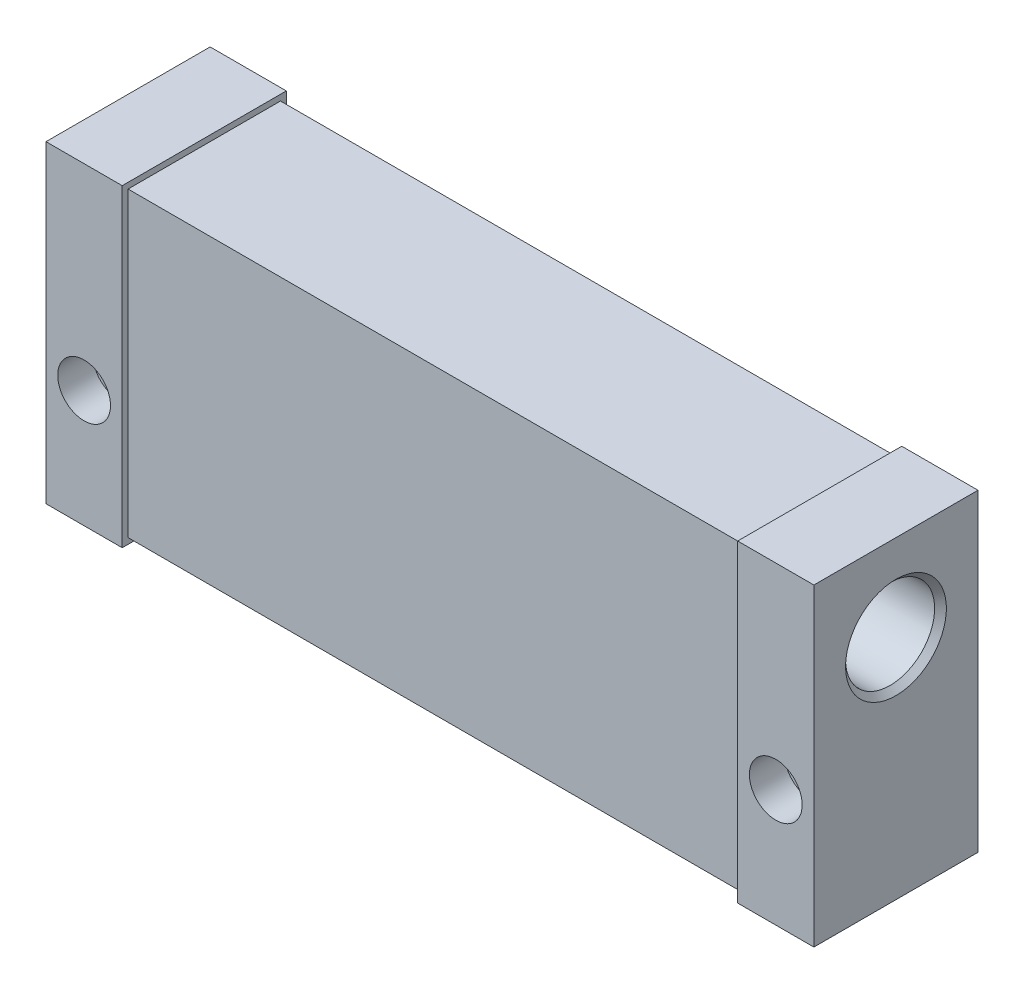
ISO-10303-21;
HEADER;
FILE_DESCRIPTION(('STEP AP214'),'2;1');
FILE_NAME('part.step','',(''),(''),'','','');
FILE_SCHEMA(('AUTOMOTIVE_DESIGN { 1 0 10303 214 1 1 1 1 }'));
ENDSEC;
DATA;
#1=APPLICATION_CONTEXT('core data for automotive mechanical design processes');
#2=APPLICATION_PROTOCOL_DEFINITION('international standard','automotive_design',2000,#1);
#3=PRODUCT_CONTEXT('',#1,'mechanical');
#4=PRODUCT('Part','Part','',(#3));
#5=PRODUCT_RELATED_PRODUCT_CATEGORY('part','',(#4));
#6=PRODUCT_DEFINITION_FORMATION('','',#4);
#7=PRODUCT_DEFINITION_CONTEXT('part definition',#1,'design');
#8=PRODUCT_DEFINITION('design','',#6,#7);
#9=PRODUCT_DEFINITION_SHAPE('','',#8);
#10=(LENGTH_UNIT() NAMED_UNIT(*) SI_UNIT(.MILLI.,.METRE.));
#11=(NAMED_UNIT(*) PLANE_ANGLE_UNIT() SI_UNIT($,.RADIAN.));
#12=(NAMED_UNIT(*) SI_UNIT($,.STERADIAN.) SOLID_ANGLE_UNIT());
#13=UNCERTAINTY_MEASURE_WITH_UNIT(LENGTH_MEASURE(1.E-05),#10,'distance_accuracy_value','');
#14=(GEOMETRIC_REPRESENTATION_CONTEXT(3) GLOBAL_UNCERTAINTY_ASSIGNED_CONTEXT((#13)) GLOBAL_UNIT_ASSIGNED_CONTEXT((#10,
#11,#12)) REPRESENTATION_CONTEXT('',''));
#15=CARTESIAN_POINT('',(0.,0.,0.));
#16=DIRECTION('',(0.,0.,1.));
#17=DIRECTION('',(1.,0.,0.));
#18=AXIS2_PLACEMENT_3D('',#15,#16,#17);
#19=CARTESIAN_POINT('',(-65.5,-26.75,14.));
#20=DIRECTION('',(0.,1.,0.));
#21=DIRECTION('',(0.,0.,1.));
#22=AXIS2_PLACEMENT_3D('',#19,#20,#21);
#23=PLANE('',#22);
#24=CARTESIAN_POINT('',(59.6552513467545,-26.75,-3.));
#25=DIRECTION('',(0.,-1.,0.));
#26=DIRECTION('',(0.,0.,-1.));
#27=AXIS2_PLACEMENT_3D('',#24,#25,#26);
#28=CIRCLE('',#27,2.1);
#29=CARTESIAN_POINT('',(59.6552513467545,-26.75,-5.1));
#30=VERTEX_POINT('',#29);
#31=EDGE_CURVE('E165',#30,#30,#28,.T.);
#32=ORIENTED_EDGE('',*,*,#31,.F.);
#33=EDGE_LOOP('',(#32));
#34=FACE_BOUND('',#33,.T.);
#35=DIRECTION('',(1.,0.,0.));
#36=VECTOR('',#35,1.);
#37=CARTESIAN_POINT('',(-65.5,-26.75,14.));
#38=LINE('',#37,#36);
#39=CARTESIAN_POINT('',(52.5,-26.75,14.));
#40=VERTEX_POINT('',#39);
#41=CARTESIAN_POINT('',(65.5,-26.75,14.));
#42=VERTEX_POINT('',#41);
#43=EDGE_CURVE('E313',#40,#42,#38,.T.);
#44=ORIENTED_EDGE('',*,*,#43,.F.);
#45=DIRECTION('',(0.,0.,-1.));
#46=VECTOR('',#45,1.);
#47=CARTESIAN_POINT('',(52.5,-26.75,14.));
#48=LINE('',#47,#46);
#49=CARTESIAN_POINT('',(52.5,-26.75,-14.));
#50=VERTEX_POINT('',#49);
#51=EDGE_CURVE('E314',#40,#50,#48,.T.);
#52=ORIENTED_EDGE('',*,*,#51,.T.);
#53=DIRECTION('',(1.,0.,0.));
#54=VECTOR('',#53,1.);
#55=CARTESIAN_POINT('',(-65.5,-26.75,-14.));
#56=LINE('',#55,#54);
#57=CARTESIAN_POINT('',(65.5,-26.75,-14.));
#58=VERTEX_POINT('',#57);
#59=EDGE_CURVE('E348',#50,#58,#56,.T.);
#60=ORIENTED_EDGE('',*,*,#59,.T.);
#61=DIRECTION('',(0.,0.,-1.));
#62=VECTOR('',#61,1.);
#63=CARTESIAN_POINT('',(65.5,-26.75,14.));
#64=LINE('',#63,#62);
#65=EDGE_CURVE('E319',#42,#58,#64,.T.);
#66=ORIENTED_EDGE('',*,*,#65,.F.);
#67=EDGE_LOOP('',(#44,#52,#60,#66));
#68=FACE_BOUND('',#67,.T.);
#69=ADVANCED_FACE('F48',(#34,#68),#23,.F.);
#70=CARTESIAN_POINT('',(-65.5,26.75,14.));
#71=DIRECTION('',(0.,-1.,0.));
#72=DIRECTION('',(0.,0.,-1.));
#73=AXIS2_PLACEMENT_3D('',#70,#71,#72);
#74=PLANE('',#73);
#75=DIRECTION('',(-1.,0.,0.));
#76=VECTOR('',#75,1.);
#77=CARTESIAN_POINT('',(-65.5,26.75,-14.));
#78=LINE('',#77,#76);
#79=CARTESIAN_POINT('',(65.5,26.75,-14.));
#80=VERTEX_POINT('',#79);
#81=CARTESIAN_POINT('',(52.5,26.75,-14.));
#82=VERTEX_POINT('',#81);
#83=EDGE_CURVE('E333',#80,#82,#78,.T.);
#84=ORIENTED_EDGE('',*,*,#83,.T.);
#85=DIRECTION('',(0.,0.,1.));
#86=VECTOR('',#85,1.);
#87=CARTESIAN_POINT('',(52.5,26.75,14.));
#88=LINE('',#87,#86);
#89=CARTESIAN_POINT('',(52.5,26.75,14.));
#90=VERTEX_POINT('',#89);
#91=EDGE_CURVE('E72',#82,#90,#88,.T.);
#92=ORIENTED_EDGE('',*,*,#91,.T.);
#93=DIRECTION('',(-1.,0.,0.));
#94=VECTOR('',#93,1.);
#95=CARTESIAN_POINT('',(-65.5,26.75,14.));
#96=LINE('',#95,#94);
#97=CARTESIAN_POINT('',(65.5,26.75,14.));
#98=VERTEX_POINT('',#97);
#99=EDGE_CURVE('E342',#98,#90,#96,.T.);
#100=ORIENTED_EDGE('',*,*,#99,.F.);
#101=DIRECTION('',(0.,0.,-1.));
#102=VECTOR('',#101,1.);
#103=CARTESIAN_POINT('',(65.5,26.75,14.));
#104=LINE('',#103,#102);
#105=EDGE_CURVE('E366',#98,#80,#104,.T.);
#106=ORIENTED_EDGE('',*,*,#105,.T.);
#107=EDGE_LOOP('',(#84,#92,#100,#106));
#108=FACE_BOUND('',#107,.T.);
#109=ADVANCED_FACE('F277',(#108),#74,.F.);
#110=CARTESIAN_POINT('',(-65.5,-26.75,14.));
#111=DIRECTION('',(0.,0.,1.));
#112=DIRECTION('',(1.,0.,0.));
#113=AXIS2_PLACEMENT_3D('',#110,#111,#112);
#114=PLANE('',#113);
#115=CARTESIAN_POINT('',(59.,-6.75,14.));
#116=DIRECTION('',(0.,0.,1.));
#117=DIRECTION('',(1.,0.,0.));
#118=AXIS2_PLACEMENT_3D('',#115,#116,#117);
#119=CIRCLE('',#118,4.5);
#120=CARTESIAN_POINT('',(63.5,-6.75,14.));
#121=VERTEX_POINT('',#120);
#122=EDGE_CURVE('E193',#121,#121,#119,.T.);
#123=ORIENTED_EDGE('',*,*,#122,.F.);
#124=EDGE_LOOP('',(#123));
#125=FACE_BOUND('',#124,.T.);
#126=DIRECTION('',(0.,1.,0.));
#127=VECTOR('',#126,1.);
#128=CARTESIAN_POINT('',(52.5,-26.75,14.));
#129=LINE('',#128,#127);
#130=EDGE_CURVE('E351',#40,#90,#129,.T.);
#131=ORIENTED_EDGE('',*,*,#130,.F.);
#132=ORIENTED_EDGE('',*,*,#43,.T.);
#133=DIRECTION('',(0.,1.,0.));
#134=VECTOR('',#133,1.);
#135=CARTESIAN_POINT('',(65.5,26.75,14.));
#136=LINE('',#135,#134);
#137=EDGE_CURVE('E331',#42,#98,#136,.T.);
#138=ORIENTED_EDGE('',*,*,#137,.T.);
#139=ORIENTED_EDGE('',*,*,#99,.T.);
#140=EDGE_LOOP('',(#131,#132,#138,#139));
#141=FACE_BOUND('',#140,.T.);
#142=ADVANCED_FACE('F266',(#125,#141),#114,.T.);
#143=CARTESIAN_POINT('',(-65.5,-26.75,-14.));
#144=DIRECTION('',(0.,0.,1.));
#145=DIRECTION('',(1.,0.,0.));
#146=AXIS2_PLACEMENT_3D('',#143,#144,#145);
#147=PLANE('',#146);
#148=CARTESIAN_POINT('',(59.,-6.75,-14.));
#149=DIRECTION('',(0.,0.,1.));
#150=DIRECTION('',(1.,0.,0.));
#151=AXIS2_PLACEMENT_3D('',#148,#149,#150);
#152=CIRCLE('',#151,2.74999999999999);
#153=CARTESIAN_POINT('',(61.75,-6.75,-14.));
#154=VERTEX_POINT('',#153);
#155=EDGE_CURVE('E182',#154,#154,#152,.T.);
#156=ORIENTED_EDGE('',*,*,#155,.T.);
#157=EDGE_LOOP('',(#156));
#158=FACE_BOUND('',#157,.T.);
#159=ORIENTED_EDGE('',*,*,#59,.F.);
#160=DIRECTION('',(0.,1.,0.));
#161=VECTOR('',#160,1.);
#162=CARTESIAN_POINT('',(52.5,-26.75,-14.));
#163=LINE('',#162,#161);
#164=EDGE_CURVE('E378',#50,#82,#163,.T.);
#165=ORIENTED_EDGE('',*,*,#164,.T.);
#166=ORIENTED_EDGE('',*,*,#83,.F.);
#167=DIRECTION('',(0.,1.,0.));
#168=VECTOR('',#167,1.);
#169=CARTESIAN_POINT('',(65.5,26.75,-14.));
#170=LINE('',#169,#168);
#171=EDGE_CURVE('E358',#58,#80,#170,.T.);
#172=ORIENTED_EDGE('',*,*,#171,.F.);
#173=EDGE_LOOP('',(#159,#165,#166,#172));
#174=FACE_BOUND('',#173,.T.);
#175=ADVANCED_FACE('F272',(#158,#174),#147,.F.);
#176=CARTESIAN_POINT('',(65.5,26.75,14.));
#177=DIRECTION('',(-1.,0.,0.));
#178=DIRECTION('',(0.,0.,1.));
#179=AXIS2_PLACEMENT_3D('',#176,#177,#178);
#180=PLANE('',#179);
#181=CARTESIAN_POINT('',(65.5,12.,0.));
#182=DIRECTION('',(-1.,0.,0.));
#183=DIRECTION('',(0.,0.,1.));
#184=AXIS2_PLACEMENT_3D('',#181,#182,#183);
#185=CIRCLE('',#184,8.59999999999998);
#186=CARTESIAN_POINT('',(65.5,12.,8.59999999999998));
#187=VERTEX_POINT('',#186);
#188=EDGE_CURVE('E12',#187,#187,#185,.T.);
#189=ORIENTED_EDGE('',*,*,#188,.T.);
#190=EDGE_LOOP('',(#189));
#191=FACE_BOUND('',#190,.T.);
#192=ORIENTED_EDGE('',*,*,#171,.T.);
#193=ORIENTED_EDGE('',*,*,#105,.F.);
#194=ORIENTED_EDGE('',*,*,#137,.F.);
#195=ORIENTED_EDGE('',*,*,#65,.T.);
#196=EDGE_LOOP('',(#192,#193,#194,#195));
#197=FACE_BOUND('',#196,.T.);
#198=ADVANCED_FACE('F259',(#191,#197),#180,.F.);
#199=CARTESIAN_POINT('',(-52.5,-25.75,13.));
#200=DIRECTION('',(0.,0.,1.));
#201=DIRECTION('',(1.,0.,0.));
#202=AXIS2_PLACEMENT_3D('',#199,#200,#201);
#203=PLANE('',#202);
#204=CARTESIAN_POINT('',(52.5,25.75,13.));
#205=DIRECTION('',(-1.,0.,0.));
#206=VECTOR('',#205,1.);
#207=LINE('',#204,#206);
#208=CARTESIAN_POINT('',(52.5,25.75,13.));
#209=VERTEX_POINT('',#208);
#210=CARTESIAN_POINT('',(-52.5,25.75,13.));
#211=VERTEX_POINT('',#210);
#212=EDGE_CURVE('E234',#209,#211,#207,.T.);
#213=ORIENTED_EDGE('',*,*,#212,.T.);
#214=DIRECTION('',(0.,1.,0.));
#215=VECTOR('',#214,1.);
#216=CARTESIAN_POINT('',(-52.5,-25.75,13.));
#217=LINE('',#216,#215);
#218=CARTESIAN_POINT('',(-52.5,-25.75,13.));
#219=VERTEX_POINT('',#218);
#220=EDGE_CURVE('E203',#219,#211,#217,.T.);
#221=ORIENTED_EDGE('',*,*,#220,.F.);
#222=DIRECTION('',(1.,0.,0.));
#223=VECTOR('',#222,1.);
#224=CARTESIAN_POINT('',(-52.5,-25.75,13.));
#225=LINE('',#224,#223);
#226=CARTESIAN_POINT('',(52.5,-25.7499999999999,13.));
#227=VERTEX_POINT('',#226);
#228=EDGE_CURVE('E198',#219,#227,#225,.T.);
#229=ORIENTED_EDGE('',*,*,#228,.T.);
#230=DIRECTION('',(0.,1.,0.));
#231=VECTOR('',#230,1.);
#232=CARTESIAN_POINT('',(52.5,-25.7499999999999,13.));
#233=LINE('',#232,#231);
#234=EDGE_CURVE('E229',#227,#209,#233,.T.);
#235=ORIENTED_EDGE('',*,*,#234,.T.);
#236=EDGE_LOOP('',(#213,#221,#229,#235));
#237=FACE_BOUND('',#236,.T.);
#238=ADVANCED_FACE('F250',(#237),#203,.T.);
#239=CARTESIAN_POINT('',(-52.5,-25.75,-13.));
#240=DIRECTION('',(0.,1.,0.));
#241=DIRECTION('',(-1.,0.,0.));
#242=AXIS2_PLACEMENT_3D('',#239,#240,#241);
#243=PLANE('',#242);
#244=DIRECTION('',(0.,0.,1.));
#245=VECTOR('',#244,1.);
#246=CARTESIAN_POINT('',(-52.5,-25.75,-13.));
#247=LINE('',#246,#245);
#248=CARTESIAN_POINT('',(-52.5,-25.75,-13.));
#249=VERTEX_POINT('',#248);
#250=EDGE_CURVE('E208',#249,#219,#247,.T.);
#251=ORIENTED_EDGE('',*,*,#250,.F.);
#252=DIRECTION('',(-1.,0.,0.));
#253=VECTOR('',#252,1.);
#254=CARTESIAN_POINT('',(-52.5,-25.75,-13.));
#255=LINE('',#254,#253);
#256=CARTESIAN_POINT('',(52.5,-25.75,-13.));
#257=VERTEX_POINT('',#256);
#258=EDGE_CURVE('E207',#257,#249,#255,.T.);
#259=ORIENTED_EDGE('',*,*,#258,.F.);
#260=DIRECTION('',(0.,0.,1.));
#261=VECTOR('',#260,1.);
#262=CARTESIAN_POINT('',(52.5,-25.75,-13.));
#263=LINE('',#262,#261);
#264=EDGE_CURVE('E205',#257,#227,#263,.T.);
#265=ORIENTED_EDGE('',*,*,#264,.T.);
#266=ORIENTED_EDGE('',*,*,#228,.F.);
#267=EDGE_LOOP('',(#251,#259,#265,#266));
#268=FACE_BOUND('',#267,.T.);
#269=ADVANCED_FACE('F260',(#268),#243,.F.);
#270=CARTESIAN_POINT('',(-52.5000000000001,25.75,-13.));
#271=DIRECTION('',(0.,0.,-1.));
#272=DIRECTION('',(-1.,0.,0.));
#273=AXIS2_PLACEMENT_3D('',#270,#271,#272);
#274=PLANE('',#273);
#275=ORIENTED_EDGE('',*,*,#258,.T.);
#276=DIRECTION('',(0.,-1.,0.));
#277=VECTOR('',#276,1.);
#278=CARTESIAN_POINT('',(-52.5,25.75,-13.));
#279=LINE('',#278,#277);
#280=CARTESIAN_POINT('',(-52.5,25.75,-13.));
#281=VERTEX_POINT('',#280);
#282=EDGE_CURVE('E217',#281,#249,#279,.T.);
#283=ORIENTED_EDGE('',*,*,#282,.F.);
#284=DIRECTION('',(1.,0.,0.));
#285=VECTOR('',#284,1.);
#286=CARTESIAN_POINT('',(-52.5000000000001,25.75,-13.));
#287=LINE('',#286,#285);
#288=CARTESIAN_POINT('',(52.5,25.75,-13.));
#289=VERTEX_POINT('',#288);
#290=EDGE_CURVE('E215',#281,#289,#287,.T.);
#291=ORIENTED_EDGE('',*,*,#290,.T.);
#292=DIRECTION('',(0.,-1.,0.));
#293=VECTOR('',#292,1.);
#294=CARTESIAN_POINT('',(52.5,25.75,-13.));
#295=LINE('',#294,#293);
#296=EDGE_CURVE('E212',#289,#257,#295,.T.);
#297=ORIENTED_EDGE('',*,*,#296,.T.);
#298=EDGE_LOOP('',(#275,#283,#291,#297));
#299=FACE_BOUND('',#298,.T.);
#300=ADVANCED_FACE('F448',(#299),#274,.T.);
#301=CARTESIAN_POINT('',(-52.5,25.75,-225.388235098391));
#302=DIRECTION('',(0.,-1.,0.));
#303=DIRECTION('',(0.,0.,-1.));
#304=AXIS2_PLACEMENT_3D('',#301,#302,#303);
#305=PLANE('',#304);
#306=DIRECTION('',(0.,0.,1.));
#307=VECTOR('',#306,1.);
#308=CARTESIAN_POINT('',(-52.5,25.75,-225.388235098391));
#309=LINE('',#308,#307);
#310=EDGE_CURVE('E196',#281,#211,#309,.T.);
#311=ORIENTED_EDGE('',*,*,#310,.T.);
#312=ORIENTED_EDGE('',*,*,#212,.F.);
#313=DIRECTION('',(0.,0.,1.));
#314=VECTOR('',#313,1.);
#315=CARTESIAN_POINT('',(52.5,25.75,-225.388235098391));
#316=LINE('',#315,#314);
#317=EDGE_CURVE('E219',#289,#209,#316,.T.);
#318=ORIENTED_EDGE('',*,*,#317,.F.);
#319=ORIENTED_EDGE('',*,*,#290,.F.);
#320=EDGE_LOOP('',(#311,#312,#318,#319));
#321=FACE_BOUND('',#320,.T.);
#322=ADVANCED_FACE('F437',(#321),#305,.F.);
#323=CARTESIAN_POINT('',(52.5,29.0354580165229,-225.388235098391));
#324=DIRECTION('',(1.,0.,0.));
#325=DIRECTION('',(0.,0.,-1.));
#326=AXIS2_PLACEMENT_3D('',#323,#324,#325);
#327=PLANE('',#326);
#328=ORIENTED_EDGE('',*,*,#130,.T.);
#329=ORIENTED_EDGE('',*,*,#91,.F.);
#330=ORIENTED_EDGE('',*,*,#164,.F.);
#331=ORIENTED_EDGE('',*,*,#51,.F.);
#332=EDGE_LOOP('',(#328,#329,#330,#331));
#333=FACE_BOUND('',#332,.T.);
#334=ORIENTED_EDGE('',*,*,#317,.T.);
#335=ORIENTED_EDGE('',*,*,#234,.F.);
#336=ORIENTED_EDGE('',*,*,#264,.F.);
#337=ORIENTED_EDGE('',*,*,#296,.F.);
#338=EDGE_LOOP('',(#334,#335,#336,#337));
#339=FACE_BOUND('',#338,.T.);
#340=ADVANCED_FACE('F446',(#333,#339),#327,.F.);
#341=CARTESIAN_POINT('',(-52.5,25.75,-225.388235098391));
#342=DIRECTION('',(-1.,0.,0.));
#343=DIRECTION('',(0.,0.,1.));
#344=AXIS2_PLACEMENT_3D('',#341,#342,#343);
#345=PLANE('',#344);
#346=DIRECTION('',(0.,-1.,0.));
#347=VECTOR('',#346,1.);
#348=CARTESIAN_POINT('',(-52.5,-26.75,14.));
#349=LINE('',#348,#347);
#350=CARTESIAN_POINT('',(-52.5,26.75,14.));
#351=VERTEX_POINT('',#350);
#352=CARTESIAN_POINT('',(-52.5,-26.75,14.));
#353=VERTEX_POINT('',#352);
#354=EDGE_CURVE('E401',#351,#353,#349,.T.);
#355=ORIENTED_EDGE('',*,*,#354,.T.);
#356=DIRECTION('',(0.,0.,1.));
#357=VECTOR('',#356,1.);
#358=CARTESIAN_POINT('',(-52.5,-26.75,14.));
#359=LINE('',#358,#357);
#360=CARTESIAN_POINT('',(-52.5,-26.75,-14.));
#361=VERTEX_POINT('',#360);
#362=EDGE_CURVE('E61',#361,#353,#359,.T.);
#363=ORIENTED_EDGE('',*,*,#362,.F.);
#364=DIRECTION('',(0.,-1.,0.));
#365=VECTOR('',#364,1.);
#366=CARTESIAN_POINT('',(-52.5,-26.75,-14.));
#367=LINE('',#366,#365);
#368=CARTESIAN_POINT('',(-52.5,26.75,-14.));
#369=VERTEX_POINT('',#368);
#370=EDGE_CURVE('E376',#369,#361,#367,.T.);
#371=ORIENTED_EDGE('',*,*,#370,.F.);
#372=DIRECTION('',(0.,0.,-1.));
#373=VECTOR('',#372,1.);
#374=CARTESIAN_POINT('',(-52.5,26.75,14.));
#375=LINE('',#374,#373);
#376=EDGE_CURVE('E403',#351,#369,#375,.T.);
#377=ORIENTED_EDGE('',*,*,#376,.F.);
#378=EDGE_LOOP('',(#355,#363,#371,#377));
#379=FACE_BOUND('',#378,.T.);
#380=ORIENTED_EDGE('',*,*,#282,.T.);
#381=ORIENTED_EDGE('',*,*,#250,.T.);
#382=ORIENTED_EDGE('',*,*,#220,.T.);
#383=ORIENTED_EDGE('',*,*,#310,.F.);
#384=EDGE_LOOP('',(#380,#381,#382,#383));
#385=FACE_BOUND('',#384,.T.);
#386=ADVANCED_FACE('F283',(#379,#385),#345,.F.);
#387=CARTESIAN_POINT('',(-65.5,26.75,14.));
#388=DIRECTION('',(1.,0.,0.));
#389=DIRECTION('',(0.,1.,0.));
#390=AXIS2_PLACEMENT_3D('',#387,#388,#389);
#391=PLANE('',#390);
#392=CARTESIAN_POINT('',(-65.5,12.,0.));
#393=DIRECTION('',(1.,0.,0.));
#394=DIRECTION('',(0.,1.,0.));
#395=AXIS2_PLACEMENT_3D('',#392,#393,#394);
#396=CIRCLE('',#395,8.60000000000004);
#397=CARTESIAN_POINT('',(-65.5,20.6,0.));
#398=VERTEX_POINT('',#397);
#399=EDGE_CURVE('E60',#398,#398,#396,.T.);
#400=ORIENTED_EDGE('',*,*,#399,.T.);
#401=EDGE_LOOP('',(#400));
#402=FACE_BOUND('',#401,.T.);
#403=DIRECTION('',(0.,-1.,0.));
#404=VECTOR('',#403,1.);
#405=CARTESIAN_POINT('',(-65.5,26.75,-14.));
#406=LINE('',#405,#404);
#407=CARTESIAN_POINT('',(-65.5,26.75,-14.));
#408=VERTEX_POINT('',#407);
#409=CARTESIAN_POINT('',(-65.5,-26.75,-14.));
#410=VERTEX_POINT('',#409);
#411=EDGE_CURVE('E347',#408,#410,#406,.T.);
#412=ORIENTED_EDGE('',*,*,#411,.T.);
#413=DIRECTION('',(0.,0.,-1.));
#414=VECTOR('',#413,1.);
#415=CARTESIAN_POINT('',(-65.5,-26.75,14.));
#416=LINE('',#415,#414);
#417=CARTESIAN_POINT('',(-65.5,-26.75,14.));
#418=VERTEX_POINT('',#417);
#419=EDGE_CURVE('E375',#418,#410,#416,.T.);
#420=ORIENTED_EDGE('',*,*,#419,.F.);
#421=DIRECTION('',(0.,-1.,0.));
#422=VECTOR('',#421,1.);
#423=CARTESIAN_POINT('',(-65.5,26.75,14.));
#424=LINE('',#423,#422);
#425=CARTESIAN_POINT('',(-65.5,26.75,14.));
#426=VERTEX_POINT('',#425);
#427=EDGE_CURVE('E321',#426,#418,#424,.T.);
#428=ORIENTED_EDGE('',*,*,#427,.F.);
#429=DIRECTION('',(0.,0.,-1.));
#430=VECTOR('',#429,1.);
#431=CARTESIAN_POINT('',(-65.5,26.75,14.));
#432=LINE('',#431,#430);
#433=EDGE_CURVE('E343',#426,#408,#432,.T.);
#434=ORIENTED_EDGE('',*,*,#433,.T.);
#435=EDGE_LOOP('',(#412,#420,#428,#434));
#436=FACE_BOUND('',#435,.T.);
#437=ADVANCED_FACE('F268',(#402,#436),#391,.F.);
#438=CARTESIAN_POINT('',(-59.,-6.75,-14.));
#439=DIRECTION('',(0.,0.,1.));
#440=DIRECTION('',(1.,0.,0.));
#441=AXIS2_PLACEMENT_3D('',#438,#439,#440);
#442=CIRCLE('',#441,2.74999999999999);
#443=CARTESIAN_POINT('',(-56.25,-6.75,-14.));
#444=VERTEX_POINT('',#443);
#445=EDGE_CURVE('E170',#444,#444,#442,.T.);
#446=ORIENTED_EDGE('',*,*,#445,.T.);
#447=EDGE_LOOP('',(#446));
#448=FACE_BOUND('',#447,.T.);
#449=EDGE_CURVE('E360',#369,#408,#78,.T.);
#450=ORIENTED_EDGE('',*,*,#449,.F.);
#451=ORIENTED_EDGE('',*,*,#370,.T.);
#452=EDGE_CURVE('E352',#410,#361,#56,.T.);
#453=ORIENTED_EDGE('',*,*,#452,.F.);
#454=ORIENTED_EDGE('',*,*,#411,.F.);
#455=EDGE_LOOP('',(#450,#451,#453,#454));
#456=FACE_BOUND('',#455,.T.);
#457=ADVANCED_FACE('F261',(#448,#456),#147,.F.);
#458=CARTESIAN_POINT('',(-59.,-6.75,14.));
#459=DIRECTION('',(0.,0.,1.));
#460=DIRECTION('',(1.,0.,0.));
#461=AXIS2_PLACEMENT_3D('',#458,#459,#460);
#462=CIRCLE('',#461,4.5);
#463=CARTESIAN_POINT('',(-54.5,-6.75,14.));
#464=VERTEX_POINT('',#463);
#465=EDGE_CURVE('E177',#464,#464,#462,.T.);
#466=ORIENTED_EDGE('',*,*,#465,.F.);
#467=EDGE_LOOP('',(#466));
#468=FACE_BOUND('',#467,.T.);
#469=ORIENTED_EDGE('',*,*,#354,.F.);
#470=EDGE_CURVE('E338',#351,#426,#96,.T.);
#471=ORIENTED_EDGE('',*,*,#470,.T.);
#472=ORIENTED_EDGE('',*,*,#427,.T.);
#473=EDGE_CURVE('E324',#418,#353,#38,.T.);
#474=ORIENTED_EDGE('',*,*,#473,.T.);
#475=EDGE_LOOP('',(#469,#471,#472,#474));
#476=FACE_BOUND('',#475,.T.);
#477=ADVANCED_FACE('F258',(#468,#476),#114,.T.);
#478=ORIENTED_EDGE('',*,*,#470,.F.);
#479=ORIENTED_EDGE('',*,*,#376,.T.);
#480=ORIENTED_EDGE('',*,*,#449,.T.);
#481=ORIENTED_EDGE('',*,*,#433,.F.);
#482=EDGE_LOOP('',(#478,#479,#480,#481));
#483=FACE_BOUND('',#482,.T.);
#484=ADVANCED_FACE('F265',(#483),#74,.F.);
#485=CARTESIAN_POINT('',(-59.,-26.75,-3.));
#486=DIRECTION('',(0.,-1.,0.));
#487=DIRECTION('',(0.,0.,-1.));
#488=AXIS2_PLACEMENT_3D('',#485,#486,#487);
#489=CIRCLE('',#488,2.1);
#490=CARTESIAN_POINT('',(-59.,-26.75,-5.1));
#491=VERTEX_POINT('',#490);
#492=EDGE_CURVE('E154',#491,#491,#489,.T.);
#493=ORIENTED_EDGE('',*,*,#492,.F.);
#494=EDGE_LOOP('',(#493));
#495=FACE_BOUND('',#494,.T.);
#496=ORIENTED_EDGE('',*,*,#452,.T.);
#497=ORIENTED_EDGE('',*,*,#362,.T.);
#498=ORIENTED_EDGE('',*,*,#473,.F.);
#499=ORIENTED_EDGE('',*,*,#419,.T.);
#500=EDGE_LOOP('',(#496,#497,#498,#499));
#501=FACE_BOUND('',#500,.T.);
#502=ADVANCED_FACE('F274',(#495,#501),#23,.F.);
#503=CARTESIAN_POINT('',(65.5,12.,0.));
#504=DIRECTION('',(-1.,0.,0.));
#505=DIRECTION('',(0.,-1.,0.));
#506=AXIS2_PLACEMENT_3D('',#503,#504,#505);
#507=CYLINDRICAL_SURFACE('',#506,7.6);
#508=CARTESIAN_POINT('',(-64.5,12.,0.));
#509=DIRECTION('',(1.,0.,0.));
#510=DIRECTION('',(0.,1.,0.));
#511=AXIS2_PLACEMENT_3D('',#508,#509,#510);
#512=CIRCLE('',#511,7.6);
#513=CARTESIAN_POINT('',(-64.5,19.6,0.));
#514=VERTEX_POINT('',#513);
#515=EDGE_CURVE('E387',#514,#514,#512,.F.);
#516=ORIENTED_EDGE('',*,*,#515,.T.);
#517=EDGE_LOOP('',(#516));
#518=FACE_BOUND('',#517,.T.);
#519=CARTESIAN_POINT('',(64.5,12.,0.));
#520=DIRECTION('',(-1.,0.,0.));
#521=DIRECTION('',(0.,0.,1.));
#522=AXIS2_PLACEMENT_3D('',#519,#520,#521);
#523=CIRCLE('',#522,7.6);
#524=CARTESIAN_POINT('',(64.5,12.,7.6));
#525=VERTEX_POINT('',#524);
#526=EDGE_CURVE('E385',#525,#525,#523,.F.);
#527=ORIENTED_EDGE('',*,*,#526,.T.);
#528=EDGE_LOOP('',(#527));
#529=FACE_BOUND('',#528,.T.);
#530=ADVANCED_FACE('F284',(#518,#529),#507,.F.);
#531=CARTESIAN_POINT('',(59.,-6.75,14.));
#532=DIRECTION('',(0.,0.,1.));
#533=DIRECTION('',(1.,0.,0.));
#534=AXIS2_PLACEMENT_3D('',#531,#532,#533);
#535=CYLINDRICAL_SURFACE('',#534,4.5);
#536=CARTESIAN_POINT('',(59.,-6.75,8.));
#537=DIRECTION('',(0.,0.,1.));
#538=DIRECTION('',(1.,0.,0.));
#539=AXIS2_PLACEMENT_3D('',#536,#537,#538);
#540=CIRCLE('',#539,4.5);
#541=CARTESIAN_POINT('',(63.5,-6.75,8.));
#542=VERTEX_POINT('',#541);
#543=EDGE_CURVE('E192',#542,#542,#540,.T.);
#544=ORIENTED_EDGE('',*,*,#543,.F.);
#545=EDGE_LOOP('',(#544));
#546=FACE_BOUND('',#545,.T.);
#547=ORIENTED_EDGE('',*,*,#122,.T.);
#548=EDGE_LOOP('',(#547));
#549=FACE_BOUND('',#548,.T.);
#550=ADVANCED_FACE('F530',(#546,#549),#535,.F.);
#551=CARTESIAN_POINT('',(61.75,-6.75,8.));
#552=DIRECTION('',(0.,0.,-1.));
#553=DIRECTION('',(-1.,0.,0.));
#554=AXIS2_PLACEMENT_3D('',#551,#552,#553);
#555=PLANE('',#554);
#556=CARTESIAN_POINT('',(59.,-6.75,8.));
#557=DIRECTION('',(0.,0.,1.));
#558=DIRECTION('',(1.,0.,0.));
#559=AXIS2_PLACEMENT_3D('',#556,#557,#558);
#560=CIRCLE('',#559,2.75);
#561=CARTESIAN_POINT('',(61.75,-6.75,8.));
#562=VERTEX_POINT('',#561);
#563=EDGE_CURVE('E190',#562,#562,#560,.T.);
#564=ORIENTED_EDGE('',*,*,#563,.F.);
#565=EDGE_LOOP('',(#564));
#566=FACE_BOUND('',#565,.T.);
#567=ORIENTED_EDGE('',*,*,#543,.T.);
#568=EDGE_LOOP('',(#567));
#569=FACE_BOUND('',#568,.T.);
#570=ADVANCED_FACE('F534',(#566,#569),#555,.F.);
#571=CARTESIAN_POINT('',(59.,-6.75,14.));
#572=DIRECTION('',(0.,0.,1.));
#573=DIRECTION('',(1.,0.,0.));
#574=AXIS2_PLACEMENT_3D('',#571,#572,#573);
#575=CYLINDRICAL_SURFACE('',#574,2.75);
#576=ORIENTED_EDGE('',*,*,#155,.F.);
#577=EDGE_LOOP('',(#576));
#578=FACE_BOUND('',#577,.T.);
#579=ORIENTED_EDGE('',*,*,#563,.T.);
#580=EDGE_LOOP('',(#579));
#581=FACE_BOUND('',#580,.T.);
#582=ADVANCED_FACE('F545',(#578,#581),#575,.F.);
#583=CARTESIAN_POINT('',(-59.,-6.75,14.));
#584=DIRECTION('',(0.,0.,1.));
#585=DIRECTION('',(1.,0.,0.));
#586=AXIS2_PLACEMENT_3D('',#583,#584,#585);
#587=CYLINDRICAL_SURFACE('',#586,4.5);
#588=CARTESIAN_POINT('',(-59.,-6.75,8.));
#589=DIRECTION('',(0.,0.,1.));
#590=DIRECTION('',(1.,0.,0.));
#591=AXIS2_PLACEMENT_3D('',#588,#589,#590);
#592=CIRCLE('',#591,4.5);
#593=CARTESIAN_POINT('',(-54.5,-6.75,8.));
#594=VERTEX_POINT('',#593);
#595=EDGE_CURVE('E174',#594,#594,#592,.T.);
#596=ORIENTED_EDGE('',*,*,#595,.F.);
#597=EDGE_LOOP('',(#596));
#598=FACE_BOUND('',#597,.T.);
#599=ORIENTED_EDGE('',*,*,#465,.T.);
#600=EDGE_LOOP('',(#599));
#601=FACE_BOUND('',#600,.T.);
#602=ADVANCED_FACE('F552',(#598,#601),#587,.F.);
#603=CARTESIAN_POINT('',(-56.25,-6.75,8.));
#604=DIRECTION('',(0.,0.,-1.));
#605=DIRECTION('',(-1.,0.,0.));
#606=AXIS2_PLACEMENT_3D('',#603,#604,#605);
#607=PLANE('',#606);
#608=CARTESIAN_POINT('',(-59.,-6.75,8.));
#609=DIRECTION('',(0.,0.,1.));
#610=DIRECTION('',(1.,0.,0.));
#611=AXIS2_PLACEMENT_3D('',#608,#609,#610);
#612=CIRCLE('',#611,2.75);
#613=CARTESIAN_POINT('',(-56.25,-6.75,8.));
#614=VERTEX_POINT('',#613);
#615=EDGE_CURVE('E171',#614,#614,#612,.T.);
#616=ORIENTED_EDGE('',*,*,#615,.F.);
#617=EDGE_LOOP('',(#616));
#618=FACE_BOUND('',#617,.T.);
#619=ORIENTED_EDGE('',*,*,#595,.T.);
#620=EDGE_LOOP('',(#619));
#621=FACE_BOUND('',#620,.T.);
#622=ADVANCED_FACE('F296',(#618,#621),#607,.F.);
#623=CARTESIAN_POINT('',(-59.,-6.75,14.));
#624=DIRECTION('',(0.,0.,1.));
#625=DIRECTION('',(1.,0.,0.));
#626=AXIS2_PLACEMENT_3D('',#623,#624,#625);
#627=CYLINDRICAL_SURFACE('',#626,2.75);
#628=ORIENTED_EDGE('',*,*,#445,.F.);
#629=EDGE_LOOP('',(#628));
#630=FACE_BOUND('',#629,.T.);
#631=ORIENTED_EDGE('',*,*,#615,.T.);
#632=EDGE_LOOP('',(#631));
#633=FACE_BOUND('',#632,.T.);
#634=ADVANCED_FACE('F288',(#630,#633),#627,.F.);
#635=CARTESIAN_POINT('',(-64.5,12.,0.));
#636=DIRECTION('',(-1.,0.,0.));
#637=DIRECTION('',(0.,-1.,0.));
#638=AXIS2_PLACEMENT_3D('',#635,#636,#637);
#639=CONICAL_SURFACE('',#638,7.6,0.785398163397454);
#640=ORIENTED_EDGE('',*,*,#399,.F.);
#641=EDGE_LOOP('',(#640));
#642=FACE_BOUND('',#641,.T.);
#643=ORIENTED_EDGE('',*,*,#515,.F.);
#644=EDGE_LOOP('',(#643));
#645=FACE_BOUND('',#644,.T.);
#646=ADVANCED_FACE('F287',(#642,#645),#639,.F.);
#647=CARTESIAN_POINT('',(65.5,12.,0.));
#648=DIRECTION('',(1.,0.,0.));
#649=DIRECTION('',(0.,0.,-1.));
#650=AXIS2_PLACEMENT_3D('',#647,#648,#649);
#651=CONICAL_SURFACE('',#650,8.59999999999998,0.785398163397438);
#652=ORIENTED_EDGE('',*,*,#526,.F.);
#653=EDGE_LOOP('',(#652));
#654=FACE_BOUND('',#653,.T.);
#655=ORIENTED_EDGE('',*,*,#188,.F.);
#656=EDGE_LOOP('',(#655));
#657=FACE_BOUND('',#656,.T.);
#658=ADVANCED_FACE('F49',(#654,#657),#651,.F.);
#659=CARTESIAN_POINT('',(59.6552513467545,-26.75,-3.));
#660=DIRECTION('',(0.,-1.,0.));
#661=DIRECTION('',(0.,0.,-1.));
#662=AXIS2_PLACEMENT_3D('',#659,#660,#661);
#663=CYLINDRICAL_SURFACE('',#662,2.1);
#664=CARTESIAN_POINT('',(59.6552513467545,-14.35,-3.));
#665=DIRECTION('',(0.,-1.,0.));
#666=DIRECTION('',(0.,0.,-1.));
#667=AXIS2_PLACEMENT_3D('',#664,#665,#666);
#668=CIRCLE('',#667,2.1);
#669=CARTESIAN_POINT('',(59.6552513467545,-14.35,-5.1));
#670=VERTEX_POINT('',#669);
#671=EDGE_CURVE('E159',#670,#670,#668,.T.);
#672=ORIENTED_EDGE('',*,*,#671,.F.);
#673=EDGE_LOOP('',(#672));
#674=FACE_BOUND('',#673,.T.);
#675=ORIENTED_EDGE('',*,*,#31,.T.);
#676=EDGE_LOOP('',(#675));
#677=FACE_BOUND('',#676,.T.);
#678=ADVANCED_FACE('F294',(#674,#677),#663,.F.);
#679=CARTESIAN_POINT('',(59.6552513467545,-14.35,-3.));
#680=DIRECTION('',(0.,-1.,0.));
#681=DIRECTION('',(0.,0.,-1.));
#682=AXIS2_PLACEMENT_3D('',#679,#680,#681);
#683=CONICAL_SURFACE('',#682,2.1,1.02974425867665);
#684=CARTESIAN_POINT('',(59.6552513467545,-13.0881927000421,-3.));
#685=VERTEX_POINT('',#684);
#686=VERTEX_LOOP('',#685);
#687=FACE_BOUND('',#686,.T.);
#688=ORIENTED_EDGE('',*,*,#671,.T.);
#689=EDGE_LOOP('',(#688));
#690=FACE_BOUND('',#689,.T.);
#691=ADVANCED_FACE('F617',(#687,#690),#683,.F.);
#692=CARTESIAN_POINT('',(-59.,-26.75,-3.));
#693=DIRECTION('',(0.,-1.,0.));
#694=DIRECTION('',(0.,0.,-1.));
#695=AXIS2_PLACEMENT_3D('',#692,#693,#694);
#696=CYLINDRICAL_SURFACE('',#695,2.1);
#697=CARTESIAN_POINT('',(-59.,-14.35,-3.));
#698=DIRECTION('',(0.,-1.,0.));
#699=DIRECTION('',(0.,0.,-1.));
#700=AXIS2_PLACEMENT_3D('',#697,#698,#699);
#701=CIRCLE('',#700,2.1);
#702=CARTESIAN_POINT('',(-59.,-14.35,-5.1));
#703=VERTEX_POINT('',#702);
#704=EDGE_CURVE('E146',#703,#703,#701,.T.);
#705=ORIENTED_EDGE('',*,*,#704,.F.);
#706=EDGE_LOOP('',(#705));
#707=FACE_BOUND('',#706,.T.);
#708=ORIENTED_EDGE('',*,*,#492,.T.);
#709=EDGE_LOOP('',(#708));
#710=FACE_BOUND('',#709,.T.);
#711=ADVANCED_FACE('F143',(#707,#710),#696,.F.);
#712=CARTESIAN_POINT('',(-59.,-14.35,-3.));
#713=DIRECTION('',(0.,-1.,0.));
#714=DIRECTION('',(0.,0.,-1.));
#715=AXIS2_PLACEMENT_3D('',#712,#713,#714);
#716=CONICAL_SURFACE('',#715,2.1,1.02974425867665);
#717=CARTESIAN_POINT('',(-59.,-13.0881927000421,-3.));
#718=VERTEX_POINT('',#717);
#719=VERTEX_LOOP('',#718);
#720=FACE_BOUND('',#719,.T.);
#721=ORIENTED_EDGE('',*,*,#704,.T.);
#722=EDGE_LOOP('',(#721));
#723=FACE_BOUND('',#722,.T.);
#724=ADVANCED_FACE('F145',(#720,#723),#716,.F.);
#725=CLOSED_SHELL('',(#69,#109,#142,#175,#198,#238,#269,#300,#322,#340,#386,#437,#457,#477,#484,
#502,#530,#550,#570,#582,#602,#622,#634,#646,#658,#678,#691,#711,#724));
#726=MANIFOLD_SOLID_BREP('B2',#725);
#727=ADVANCED_BREP_SHAPE_REPRESENTATION('',(#18,#726),#14);
#728=SHAPE_DEFINITION_REPRESENTATION(#9,#727);
ENDSEC;
END-ISO-10303-21;
